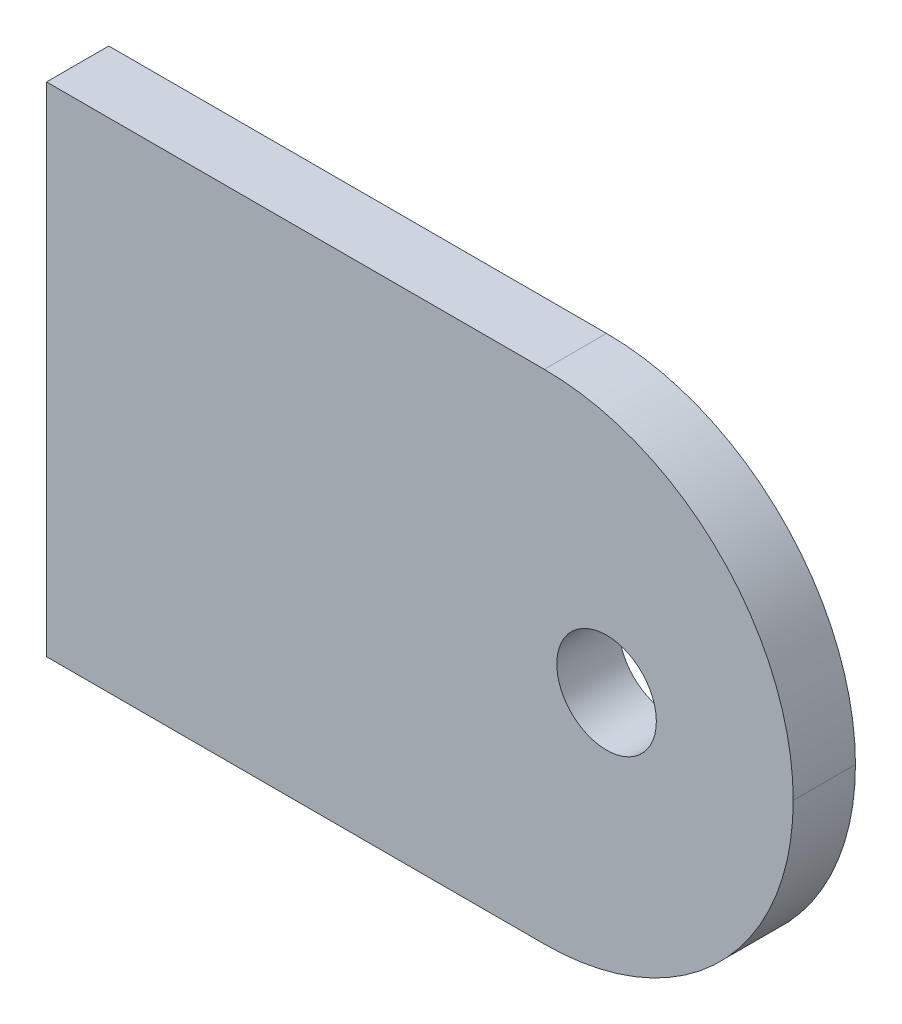
ISO-10303-21;
HEADER;
FILE_DESCRIPTION(('STEP AP214'),'2;1');
FILE_NAME('part.step','',(''),(''),'','','');
FILE_SCHEMA(('AUTOMOTIVE_DESIGN { 1 0 10303 214 1 1 1 1 }'));
ENDSEC;
DATA;
#1=APPLICATION_CONTEXT('core data for automotive mechanical design processes');
#2=APPLICATION_PROTOCOL_DEFINITION('international standard','automotive_design',2000,#1);
#3=PRODUCT_CONTEXT('',#1,'mechanical');
#4=PRODUCT('Part','Part','',(#3));
#5=PRODUCT_RELATED_PRODUCT_CATEGORY('part','',(#4));
#6=PRODUCT_DEFINITION_FORMATION('','',#4);
#7=PRODUCT_DEFINITION_CONTEXT('part definition',#1,'design');
#8=PRODUCT_DEFINITION('design','',#6,#7);
#9=PRODUCT_DEFINITION_SHAPE('','',#8);
#10=(LENGTH_UNIT() NAMED_UNIT(*) SI_UNIT(.MILLI.,.METRE.));
#11=(NAMED_UNIT(*) PLANE_ANGLE_UNIT() SI_UNIT($,.RADIAN.));
#12=(NAMED_UNIT(*) SI_UNIT($,.STERADIAN.) SOLID_ANGLE_UNIT());
#13=UNCERTAINTY_MEASURE_WITH_UNIT(LENGTH_MEASURE(1.E-05),#10,'distance_accuracy_value','');
#14=(GEOMETRIC_REPRESENTATION_CONTEXT(3) GLOBAL_UNCERTAINTY_ASSIGNED_CONTEXT((#13)) GLOBAL_UNIT_ASSIGNED_CONTEXT((#10,
#11,#12)) REPRESENTATION_CONTEXT('',''));
#15=CARTESIAN_POINT('',(0.,0.,0.));
#16=DIRECTION('',(0.,0.,1.));
#17=DIRECTION('',(1.,0.,0.));
#18=AXIS2_PLACEMENT_3D('',#15,#16,#17);
#19=CARTESIAN_POINT('',(38.1,0.,3.175));
#20=DIRECTION('',(0.,1.,0.));
#21=DIRECTION('',(0.,0.,1.));
#22=AXIS2_PLACEMENT_3D('',#19,#20,#21);
#23=PLANE('',#22);
#24=DIRECTION('',(1.,0.,0.));
#25=VECTOR('',#24,1.);
#26=CARTESIAN_POINT('',(38.1,0.,0.));
#27=LINE('',#26,#25);
#28=CARTESIAN_POINT('',(0.,0.,0.));
#29=VERTEX_POINT('',#28);
#30=CARTESIAN_POINT('',(25.4,0.,0.));
#31=VERTEX_POINT('',#30);
#32=EDGE_CURVE('E103',#29,#31,#27,.T.);
#33=ORIENTED_EDGE('',*,*,#32,.T.);
#34=DIRECTION('',(0.,0.,-1.));
#35=VECTOR('',#34,1.);
#36=CARTESIAN_POINT('',(25.4,0.,3.175));
#37=LINE('',#36,#35);
#38=CARTESIAN_POINT('',(25.4,0.,3.175));
#39=VERTEX_POINT('',#38);
#40=EDGE_CURVE('E112',#31,#39,#37,.F.);
#41=ORIENTED_EDGE('',*,*,#40,.T.);
#42=DIRECTION('',(1.,0.,0.));
#43=VECTOR('',#42,1.);
#44=CARTESIAN_POINT('',(38.1,0.,3.175));
#45=LINE('',#44,#43);
#46=CARTESIAN_POINT('',(0.,0.,3.175));
#47=VERTEX_POINT('',#46);
#48=EDGE_CURVE('E84',#47,#39,#45,.T.);
#49=ORIENTED_EDGE('',*,*,#48,.F.);
#50=DIRECTION('',(0.,0.,-1.));
#51=VECTOR('',#50,1.);
#52=CARTESIAN_POINT('',(0.,0.,3.175));
#53=LINE('',#52,#51);
#54=EDGE_CURVE('E94',#47,#29,#53,.T.);
#55=ORIENTED_EDGE('',*,*,#54,.T.);
#56=EDGE_LOOP('',(#33,#41,#49,#55));
#57=FACE_BOUND('',#56,.T.);
#58=ADVANCED_FACE('F35',(#57),#23,.F.);
#59=CARTESIAN_POINT('',(0.,25.4,3.175));
#60=DIRECTION('',(0.,-1.,0.));
#61=DIRECTION('',(0.,0.,-1.));
#62=AXIS2_PLACEMENT_3D('',#59,#60,#61);
#63=PLANE('',#62);
#64=DIRECTION('',(-1.,0.,0.));
#65=VECTOR('',#64,1.);
#66=CARTESIAN_POINT('',(0.,25.4,3.175));
#67=LINE('',#66,#65);
#68=CARTESIAN_POINT('',(25.4,25.4,3.175));
#69=VERTEX_POINT('',#68);
#70=CARTESIAN_POINT('',(0.,25.4,3.175));
#71=VERTEX_POINT('',#70);
#72=EDGE_CURVE('E76',#69,#71,#67,.T.);
#73=ORIENTED_EDGE('',*,*,#72,.F.);
#74=DIRECTION('',(0.,0.,-1.));
#75=VECTOR('',#74,1.);
#76=CARTESIAN_POINT('',(25.4,25.4,3.175));
#77=LINE('',#76,#75);
#78=CARTESIAN_POINT('',(25.4,25.4,0.));
#79=VERTEX_POINT('',#78);
#80=EDGE_CURVE('E11',#69,#79,#77,.T.);
#81=ORIENTED_EDGE('',*,*,#80,.T.);
#82=DIRECTION('',(-1.,0.,0.));
#83=VECTOR('',#82,1.);
#84=CARTESIAN_POINT('',(0.,25.4,0.));
#85=LINE('',#84,#83);
#86=CARTESIAN_POINT('',(0.,25.4,0.));
#87=VERTEX_POINT('',#86);
#88=EDGE_CURVE('E90',#79,#87,#85,.T.);
#89=ORIENTED_EDGE('',*,*,#88,.T.);
#90=DIRECTION('',(0.,0.,-1.));
#91=VECTOR('',#90,1.);
#92=CARTESIAN_POINT('',(0.,25.4,3.175));
#93=LINE('',#92,#91);
#94=EDGE_CURVE('E87',#71,#87,#93,.T.);
#95=ORIENTED_EDGE('',*,*,#94,.F.);
#96=EDGE_LOOP('',(#73,#81,#89,#95));
#97=FACE_BOUND('',#96,.T.);
#98=ADVANCED_FACE('F88',(#97),#63,.F.);
#99=CARTESIAN_POINT('',(0.,0.,3.175));
#100=DIRECTION('',(1.,0.,0.));
#101=DIRECTION('',(0.,0.,-1.));
#102=AXIS2_PLACEMENT_3D('',#99,#100,#101);
#103=PLANE('',#102);
#104=DIRECTION('',(0.,-1.,0.));
#105=VECTOR('',#104,1.);
#106=CARTESIAN_POINT('',(0.,0.,0.));
#107=LINE('',#106,#105);
#108=EDGE_CURVE('E107',#87,#29,#107,.T.);
#109=ORIENTED_EDGE('',*,*,#108,.T.);
#110=ORIENTED_EDGE('',*,*,#54,.F.);
#111=DIRECTION('',(0.,-1.,0.));
#112=VECTOR('',#111,1.);
#113=CARTESIAN_POINT('',(0.,0.,3.175));
#114=LINE('',#113,#112);
#115=EDGE_CURVE('E80',#71,#47,#114,.T.);
#116=ORIENTED_EDGE('',*,*,#115,.F.);
#117=ORIENTED_EDGE('',*,*,#94,.T.);
#118=EDGE_LOOP('',(#109,#110,#116,#117));
#119=FACE_BOUND('',#118,.T.);
#120=ADVANCED_FACE('F96',(#119),#103,.F.);
#121=CARTESIAN_POINT('',(0.,0.,3.175));
#122=DIRECTION('',(0.,0.,-1.));
#123=DIRECTION('',(-1.,0.,0.));
#124=AXIS2_PLACEMENT_3D('',#121,#122,#123);
#125=PLANE('',#124);
#126=CARTESIAN_POINT('',(28.575,12.7,3.175));
#127=DIRECTION('',(0.,0.,1.));
#128=DIRECTION('',(1.,0.,0.));
#129=AXIS2_PLACEMENT_3D('',#126,#127,#128);
#130=CIRCLE('',#129,2.54);
#131=CARTESIAN_POINT('',(31.115,12.7,3.175));
#132=VERTEX_POINT('',#131);
#133=EDGE_CURVE('E122',#132,#132,#130,.T.);
#134=ORIENTED_EDGE('',*,*,#133,.F.);
#135=EDGE_LOOP('',(#134));
#136=FACE_BOUND('',#135,.T.);
#137=ORIENTED_EDGE('',*,*,#48,.T.);
#138=CARTESIAN_POINT('',(25.4,12.7,3.175));
#139=DIRECTION('',(0.,0.,-1.));
#140=DIRECTION('',(-1.,0.,0.));
#141=AXIS2_PLACEMENT_3D('',#138,#139,#140);
#142=CIRCLE('',#141,12.7);
#143=CARTESIAN_POINT('',(38.1,12.7,3.175));
#144=VERTEX_POINT('',#143);
#145=EDGE_CURVE('E44',#39,#144,#142,.F.);
#146=ORIENTED_EDGE('',*,*,#145,.T.);
#147=CARTESIAN_POINT('',(25.4,12.7,3.175));
#148=DIRECTION('',(0.,0.,-1.));
#149=DIRECTION('',(-1.,0.,0.));
#150=AXIS2_PLACEMENT_3D('',#147,#148,#149);
#151=CIRCLE('',#150,12.7);
#152=EDGE_CURVE('E51',#144,#69,#151,.F.);
#153=ORIENTED_EDGE('',*,*,#152,.T.);
#154=ORIENTED_EDGE('',*,*,#72,.T.);
#155=ORIENTED_EDGE('',*,*,#115,.T.);
#156=EDGE_LOOP('',(#137,#146,#153,#154,#155));
#157=FACE_BOUND('',#156,.T.);
#158=ADVANCED_FACE('F78',(#136,#157),#125,.F.);
#159=CARTESIAN_POINT('',(0.,0.,0.));
#160=DIRECTION('',(0.,0.,-1.));
#161=DIRECTION('',(-1.,0.,0.));
#162=AXIS2_PLACEMENT_3D('',#159,#160,#161);
#163=PLANE('',#162);
#164=CARTESIAN_POINT('',(28.575,12.7,0.));
#165=DIRECTION('',(0.,0.,1.));
#166=DIRECTION('',(1.,0.,0.));
#167=AXIS2_PLACEMENT_3D('',#164,#165,#166);
#168=CIRCLE('',#167,2.54);
#169=CARTESIAN_POINT('',(31.115,12.7,0.));
#170=VERTEX_POINT('',#169);
#171=EDGE_CURVE('E125',#170,#170,#168,.T.);
#172=ORIENTED_EDGE('',*,*,#171,.T.);
#173=EDGE_LOOP('',(#172));
#174=FACE_BOUND('',#173,.T.);
#175=CARTESIAN_POINT('',(25.4,12.7,0.));
#176=DIRECTION('',(0.,0.,-1.));
#177=DIRECTION('',(-1.,0.,0.));
#178=AXIS2_PLACEMENT_3D('',#175,#176,#177);
#179=CIRCLE('',#178,12.7);
#180=CARTESIAN_POINT('',(38.1,12.7,0.));
#181=VERTEX_POINT('',#180);
#182=EDGE_CURVE('E93',#79,#181,#179,.T.);
#183=ORIENTED_EDGE('',*,*,#182,.T.);
#184=CARTESIAN_POINT('',(25.4,12.7,0.));
#185=DIRECTION('',(0.,0.,-1.));
#186=DIRECTION('',(-1.,0.,0.));
#187=AXIS2_PLACEMENT_3D('',#184,#185,#186);
#188=CIRCLE('',#187,12.7);
#189=EDGE_CURVE('E110',#181,#31,#188,.T.);
#190=ORIENTED_EDGE('',*,*,#189,.T.);
#191=ORIENTED_EDGE('',*,*,#32,.F.);
#192=ORIENTED_EDGE('',*,*,#108,.F.);
#193=ORIENTED_EDGE('',*,*,#88,.F.);
#194=EDGE_LOOP('',(#183,#190,#191,#192,#193));
#195=FACE_BOUND('',#194,.T.);
#196=ADVANCED_FACE('F135',(#174,#195),#163,.T.);
#197=CARTESIAN_POINT('',(25.4,12.7,3.175));
#198=DIRECTION('',(0.,0.,-1.));
#199=DIRECTION('',(-1.,0.,0.));
#200=AXIS2_PLACEMENT_3D('',#197,#198,#199);
#201=CYLINDRICAL_SURFACE('',#200,12.7);
#202=ORIENTED_EDGE('',*,*,#80,.F.);
#203=ORIENTED_EDGE('',*,*,#152,.F.);
#204=DIRECTION('',(0.,0.,-1.));
#205=VECTOR('',#204,1.);
#206=CARTESIAN_POINT('',(38.1,12.7,3.175));
#207=LINE('',#206,#205);
#208=EDGE_CURVE('E39',#181,#144,#207,.F.);
#209=ORIENTED_EDGE('',*,*,#208,.F.);
#210=ORIENTED_EDGE('',*,*,#182,.F.);
#211=EDGE_LOOP('',(#202,#203,#209,#210));
#212=FACE_BOUND('',#211,.T.);
#213=ADVANCED_FACE('F37',(#212),#201,.T.);
#214=CARTESIAN_POINT('',(25.4,12.7,3.175));
#215=DIRECTION('',(0.,0.,-1.));
#216=DIRECTION('',(-1.,0.,0.));
#217=AXIS2_PLACEMENT_3D('',#214,#215,#216);
#218=CYLINDRICAL_SURFACE('',#217,12.7);
#219=ORIENTED_EDGE('',*,*,#145,.F.);
#220=ORIENTED_EDGE('',*,*,#40,.F.);
#221=ORIENTED_EDGE('',*,*,#189,.F.);
#222=ORIENTED_EDGE('',*,*,#208,.T.);
#223=EDGE_LOOP('',(#219,#220,#221,#222));
#224=FACE_BOUND('',#223,.T.);
#225=ADVANCED_FACE('F131',(#224),#218,.T.);
#226=CARTESIAN_POINT('',(28.575,12.7,0.));
#227=DIRECTION('',(0.,0.,1.));
#228=DIRECTION('',(1.,0.,0.));
#229=AXIS2_PLACEMENT_3D('',#226,#227,#228);
#230=CYLINDRICAL_SURFACE('',#229,2.54);
#231=ORIENTED_EDGE('',*,*,#171,.F.);
#232=EDGE_LOOP('',(#231));
#233=FACE_BOUND('',#232,.T.);
#234=ORIENTED_EDGE('',*,*,#133,.T.);
#235=EDGE_LOOP('',(#234));
#236=FACE_BOUND('',#235,.T.);
#237=ADVANCED_FACE('F152',(#233,#236),#230,.F.);
#238=CLOSED_SHELL('',(#58,#98,#120,#158,#196,#213,#225,#237));
#239=MANIFOLD_SOLID_BREP('B2',#238);
#240=ADVANCED_BREP_SHAPE_REPRESENTATION('',(#18,#239),#14);
#241=SHAPE_DEFINITION_REPRESENTATION(#9,#240);
ENDSEC;
END-ISO-10303-21;
